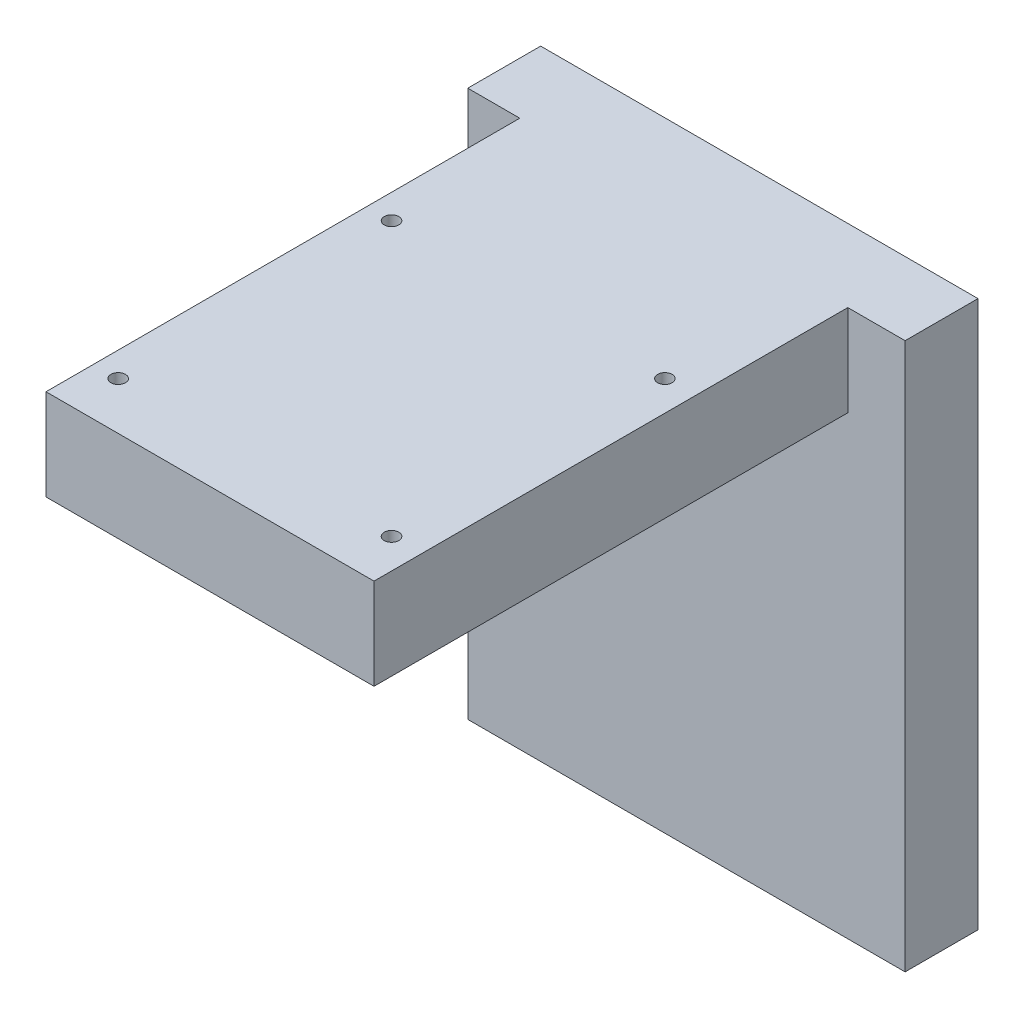
ISO-10303-21;
HEADER;
FILE_DESCRIPTION(('STEP AP214'),'2;1');
FILE_NAME('part.step','',(''),(''),'','','');
FILE_SCHEMA(('AUTOMOTIVE_DESIGN { 1 0 10303 214 1 1 1 1 }'));
ENDSEC;
DATA;
#1=APPLICATION_CONTEXT('core data for automotive mechanical design processes');
#2=APPLICATION_PROTOCOL_DEFINITION('international standard','automotive_design',2000,#1);
#3=PRODUCT_CONTEXT('',#1,'mechanical');
#4=PRODUCT('Part','Part','',(#3));
#5=PRODUCT_RELATED_PRODUCT_CATEGORY('part','',(#4));
#6=PRODUCT_DEFINITION_FORMATION('','',#4);
#7=PRODUCT_DEFINITION_CONTEXT('part definition',#1,'design');
#8=PRODUCT_DEFINITION('design','',#6,#7);
#9=PRODUCT_DEFINITION_SHAPE('','',#8);
#10=(LENGTH_UNIT() NAMED_UNIT(*) SI_UNIT(.MILLI.,.METRE.));
#11=(NAMED_UNIT(*) PLANE_ANGLE_UNIT() SI_UNIT($,.RADIAN.));
#12=(NAMED_UNIT(*) SI_UNIT($,.STERADIAN.) SOLID_ANGLE_UNIT());
#13=UNCERTAINTY_MEASURE_WITH_UNIT(LENGTH_MEASURE(1.E-05),#10,'distance_accuracy_value','');
#14=(GEOMETRIC_REPRESENTATION_CONTEXT(3) GLOBAL_UNCERTAINTY_ASSIGNED_CONTEXT((#13)) GLOBAL_UNIT_ASSIGNED_CONTEXT((#10,
#11,#12)) REPRESENTATION_CONTEXT('',''));
#15=CARTESIAN_POINT('',(0.,0.,0.));
#16=DIRECTION('',(0.,0.,1.));
#17=DIRECTION('',(1.,0.,0.));
#18=AXIS2_PLACEMENT_3D('',#15,#16,#17);
#19=CARTESIAN_POINT('',(-51.4923970450176,20.,42.397966669969));
#20=DIRECTION('',(0.,1.,0.));
#21=DIRECTION('',(0.,0.,1.));
#22=AXIS2_PLACEMENT_3D('',#19,#20,#21);
#23=CYLINDRICAL_SURFACE('',#22,2.);
#24=CARTESIAN_POINT('',(-51.4923970450176,150.,42.397966669969));
#25=DIRECTION('',(0.,1.,0.));
#26=DIRECTION('',(0.,0.,1.));
#27=AXIS2_PLACEMENT_3D('',#24,#25,#26);
#28=CIRCLE('',#27,2.);
#29=CARTESIAN_POINT('',(-51.4923970450176,150.,44.397966669969));
#30=VERTEX_POINT('',#29);
#31=EDGE_CURVE('E154',#30,#30,#28,.T.);
#32=ORIENTED_EDGE('',*,*,#31,.T.);
#33=EDGE_LOOP('',(#32));
#34=FACE_BOUND('',#33,.T.);
#35=CARTESIAN_POINT('',(-51.4923970450176,142.,42.397966669969));
#36=DIRECTION('',(0.,-1.,0.));
#37=DIRECTION('',(1.,0.,0.));
#38=AXIS2_PLACEMENT_3D('',#35,#36,#37);
#39=CIRCLE('',#38,2.);
#40=CARTESIAN_POINT('',(-49.4923970450176,142.,42.397966669969));
#41=VERTEX_POINT('',#40);
#42=EDGE_CURVE('E43',#41,#41,#39,.F.);
#43=ORIENTED_EDGE('',*,*,#42,.F.);
#44=EDGE_LOOP('',(#43));
#45=FACE_BOUND('',#44,.T.);
#46=ADVANCED_FACE('F39',(#34,#45),#23,.F.);
#47=CARTESIAN_POINT('',(23.5076029549824,20.,117.400462624399));
#48=DIRECTION('',(0.,1.,0.));
#49=DIRECTION('',(0.,0.,1.));
#50=AXIS2_PLACEMENT_3D('',#47,#48,#49);
#51=CYLINDRICAL_SURFACE('',#50,2.);
#52=CARTESIAN_POINT('',(23.5076029549824,150.,117.400462624399));
#53=DIRECTION('',(0.,1.,0.));
#54=DIRECTION('',(0.,0.,1.));
#55=AXIS2_PLACEMENT_3D('',#52,#53,#54);
#56=CIRCLE('',#55,2.);
#57=CARTESIAN_POINT('',(23.5076029549824,150.,119.400462624399));
#58=VERTEX_POINT('',#57);
#59=EDGE_CURVE('E212',#58,#58,#56,.T.);
#60=ORIENTED_EDGE('',*,*,#59,.T.);
#61=EDGE_LOOP('',(#60));
#62=FACE_BOUND('',#61,.T.);
#63=CARTESIAN_POINT('',(23.5076029549824,142.,117.400462624399));
#64=DIRECTION('',(0.,-1.,0.));
#65=DIRECTION('',(1.,0.,0.));
#66=AXIS2_PLACEMENT_3D('',#63,#64,#65);
#67=CIRCLE('',#66,2.);
#68=CARTESIAN_POINT('',(25.5076029549824,142.,117.400462624399));
#69=VERTEX_POINT('',#68);
#70=EDGE_CURVE('E205',#69,#69,#67,.F.);
#71=ORIENTED_EDGE('',*,*,#70,.F.);
#72=EDGE_LOOP('',(#71));
#73=FACE_BOUND('',#72,.T.);
#74=ADVANCED_FACE('F265',(#62,#73),#51,.F.);
#75=CARTESIAN_POINT('',(-51.4923970450176,20.,117.400462624399));
#76=DIRECTION('',(0.,1.,0.));
#77=DIRECTION('',(0.,0.,1.));
#78=AXIS2_PLACEMENT_3D('',#75,#76,#77);
#79=CYLINDRICAL_SURFACE('',#78,2.);
#80=CARTESIAN_POINT('',(-51.4923970450176,150.,117.400462624399));
#81=DIRECTION('',(0.,1.,0.));
#82=DIRECTION('',(0.,0.,1.));
#83=AXIS2_PLACEMENT_3D('',#80,#81,#82);
#84=CIRCLE('',#83,2.);
#85=CARTESIAN_POINT('',(-51.4923970450176,150.,119.400462624399));
#86=VERTEX_POINT('',#85);
#87=EDGE_CURVE('E217',#86,#86,#84,.T.);
#88=ORIENTED_EDGE('',*,*,#87,.T.);
#89=EDGE_LOOP('',(#88));
#90=FACE_BOUND('',#89,.T.);
#91=CARTESIAN_POINT('',(-51.4923970450176,142.,117.400462624399));
#92=DIRECTION('',(0.,-1.,0.));
#93=DIRECTION('',(1.,0.,0.));
#94=AXIS2_PLACEMENT_3D('',#91,#92,#93);
#95=CIRCLE('',#94,2.);
#96=CARTESIAN_POINT('',(-49.4923970450176,142.,117.400462624399));
#97=VERTEX_POINT('',#96);
#98=EDGE_CURVE('E201',#97,#97,#95,.F.);
#99=ORIENTED_EDGE('',*,*,#98,.F.);
#100=EDGE_LOOP('',(#99));
#101=FACE_BOUND('',#100,.T.);
#102=ADVANCED_FACE('F270',(#90,#101),#79,.F.);
#103=CARTESIAN_POINT('',(23.5076029134505,20.,42.4004626243991));
#104=DIRECTION('',(0.,1.,0.));
#105=DIRECTION('',(0.,0.,1.));
#106=AXIS2_PLACEMENT_3D('',#103,#104,#105);
#107=CYLINDRICAL_SURFACE('',#106,2.00000000000001);
#108=CARTESIAN_POINT('',(23.5076029134505,150.,42.4004626243991));
#109=DIRECTION('',(0.,1.,0.));
#110=DIRECTION('',(0.,0.,1.));
#111=AXIS2_PLACEMENT_3D('',#108,#109,#110);
#112=CIRCLE('',#111,2.00000000000001);
#113=CARTESIAN_POINT('',(23.5076029134505,150.,44.4004626243991));
#114=VERTEX_POINT('',#113);
#115=EDGE_CURVE('E223',#114,#114,#112,.T.);
#116=ORIENTED_EDGE('',*,*,#115,.T.);
#117=EDGE_LOOP('',(#116));
#118=FACE_BOUND('',#117,.T.);
#119=CARTESIAN_POINT('',(23.5076029134505,142.,42.4004626243991));
#120=DIRECTION('',(0.,-1.,0.));
#121=DIRECTION('',(1.,0.,0.));
#122=AXIS2_PLACEMENT_3D('',#119,#120,#121);
#123=CIRCLE('',#122,2.00000000000001);
#124=CARTESIAN_POINT('',(25.5076029134505,142.,42.4004626243991));
#125=VERTEX_POINT('',#124);
#126=EDGE_CURVE('E197',#125,#125,#123,.F.);
#127=ORIENTED_EDGE('',*,*,#126,.F.);
#128=EDGE_LOOP('',(#127));
#129=FACE_BOUND('',#128,.T.);
#130=ADVANCED_FACE('F393',(#118,#129),#107,.F.);
#131=CARTESIAN_POINT('',(-72.5362318840579,150.,0.434782608695648));
#132=DIRECTION('',(0.,0.,-1.));
#133=DIRECTION('',(-1.,0.,0.));
#134=AXIS2_PLACEMENT_3D('',#131,#132,#133);
#135=PLANE('',#134);
#136=DIRECTION('',(0.,-1.,0.));
#137=VECTOR('',#136,1.);
#138=CARTESIAN_POINT('',(-58.2615279703338,150.,0.434782608695648));
#139=LINE('',#138,#137);
#140=CARTESIAN_POINT('',(-58.2615279703338,150.,0.434782608695648));
#141=VERTEX_POINT('',#140);
#142=CARTESIAN_POINT('',(-58.2615279703338,125.,0.434782608695648));
#143=VERTEX_POINT('',#142);
#144=EDGE_CURVE('E129',#141,#143,#139,.T.);
#145=ORIENTED_EDGE('',*,*,#144,.F.);
#146=DIRECTION('',(1.,0.,0.));
#147=VECTOR('',#146,1.);
#148=CARTESIAN_POINT('',(-72.5362318840579,150.,0.434782608695648));
#149=LINE('',#148,#147);
#150=CARTESIAN_POINT('',(-72.5362318840579,150.,0.434782608695648));
#151=VERTEX_POINT('',#150);
#152=EDGE_CURVE('E94',#151,#141,#149,.T.);
#153=ORIENTED_EDGE('',*,*,#152,.F.);
#154=DIRECTION('',(0.,-1.,0.));
#155=VECTOR('',#154,1.);
#156=CARTESIAN_POINT('',(-72.5362318840579,150.,0.434782608695648));
#157=LINE('',#156,#155);
#158=CARTESIAN_POINT('',(-72.5362318840579,0.,0.434782608695648));
#159=VERTEX_POINT('',#158);
#160=EDGE_CURVE('E11',#151,#159,#157,.T.);
#161=ORIENTED_EDGE('',*,*,#160,.T.);
#162=DIRECTION('',(1.,0.,0.));
#163=VECTOR('',#162,1.);
#164=CARTESIAN_POINT('',(-72.5362318840579,0.,0.434782608695648));
#165=LINE('',#164,#163);
#166=CARTESIAN_POINT('',(47.4637681159421,0.,0.434782608695648));
#167=VERTEX_POINT('',#166);
#168=EDGE_CURVE('E181',#159,#167,#165,.T.);
#169=ORIENTED_EDGE('',*,*,#168,.T.);
#170=DIRECTION('',(0.,-1.,0.));
#171=VECTOR('',#170,1.);
#172=CARTESIAN_POINT('',(47.4637681159421,150.,0.434782608695648));
#173=LINE('',#172,#171);
#174=CARTESIAN_POINT('',(47.4637681159421,150.,0.434782608695648));
#175=VERTEX_POINT('',#174);
#176=EDGE_CURVE('E49',#175,#167,#173,.T.);
#177=ORIENTED_EDGE('',*,*,#176,.F.);
#178=CARTESIAN_POINT('',(31.7384720296662,150.,0.434782608695648));
#179=VERTEX_POINT('',#178);
#180=EDGE_CURVE('E169',#179,#175,#149,.T.);
#181=ORIENTED_EDGE('',*,*,#180,.F.);
#182=DIRECTION('',(0.,-1.,0.));
#183=VECTOR('',#182,1.);
#184=CARTESIAN_POINT('',(31.7384720296662,150.,0.434782608695648));
#185=LINE('',#184,#183);
#186=CARTESIAN_POINT('',(31.7384720296662,125.,0.434782608695648));
#187=VERTEX_POINT('',#186);
#188=EDGE_CURVE('E153',#179,#187,#185,.T.);
#189=ORIENTED_EDGE('',*,*,#188,.T.);
#190=DIRECTION('',(1.,0.,0.));
#191=VECTOR('',#190,1.);
#192=CARTESIAN_POINT('',(-58.2615279703338,125.,0.434782608695648));
#193=LINE('',#192,#191);
#194=EDGE_CURVE('E57',#143,#187,#193,.T.);
#195=ORIENTED_EDGE('',*,*,#194,.F.);
#196=EDGE_LOOP('',(#145,#153,#161,#169,#177,#181,#189,#195));
#197=FACE_BOUND('',#196,.T.);
#198=ADVANCED_FACE('F247',(#197),#135,.F.);
#199=CARTESIAN_POINT('',(-72.5362318840579,150.,-19.5652173913044));
#200=DIRECTION('',(1.,0.,0.));
#201=DIRECTION('',(0.,0.,-1.));
#202=AXIS2_PLACEMENT_3D('',#199,#200,#201);
#203=PLANE('',#202);
#204=DIRECTION('',(0.,0.,1.));
#205=VECTOR('',#204,1.);
#206=CARTESIAN_POINT('',(-72.5362318840579,0.,-19.5652173913044));
#207=LINE('',#206,#205);
#208=CARTESIAN_POINT('',(-72.5362318840579,0.,-19.5652173913044));
#209=VERTEX_POINT('',#208);
#210=EDGE_CURVE('E137',#209,#159,#207,.T.);
#211=ORIENTED_EDGE('',*,*,#210,.T.);
#212=ORIENTED_EDGE('',*,*,#160,.F.);
#213=DIRECTION('',(0.,0.,1.));
#214=VECTOR('',#213,1.);
#215=CARTESIAN_POINT('',(-72.5362318840579,150.,-19.5652173913044));
#216=LINE('',#215,#214);
#217=CARTESIAN_POINT('',(-72.5362318840579,150.,-19.5652173913044));
#218=VERTEX_POINT('',#217);
#219=EDGE_CURVE('E166',#218,#151,#216,.T.);
#220=ORIENTED_EDGE('',*,*,#219,.F.);
#221=DIRECTION('',(0.,-1.,0.));
#222=VECTOR('',#221,1.);
#223=CARTESIAN_POINT('',(-72.5362318840579,150.,-19.5652173913044));
#224=LINE('',#223,#222);
#225=EDGE_CURVE('E177',#218,#209,#224,.T.);
#226=ORIENTED_EDGE('',*,*,#225,.T.);
#227=EDGE_LOOP('',(#211,#212,#220,#226));
#228=FACE_BOUND('',#227,.T.);
#229=ADVANCED_FACE('F41',(#228),#203,.F.);
#230=CARTESIAN_POINT('',(47.4637681159421,150.,-19.5652173913044));
#231=DIRECTION('',(-1.,0.,0.));
#232=DIRECTION('',(0.,0.,1.));
#233=AXIS2_PLACEMENT_3D('',#230,#231,#232);
#234=PLANE('',#233);
#235=DIRECTION('',(0.,0.,-1.));
#236=VECTOR('',#235,1.);
#237=CARTESIAN_POINT('',(47.4637681159421,0.,-19.5652173913044));
#238=LINE('',#237,#236);
#239=CARTESIAN_POINT('',(47.4637681159421,0.,-19.5652173913044));
#240=VERTEX_POINT('',#239);
#241=EDGE_CURVE('E184',#167,#240,#238,.T.);
#242=ORIENTED_EDGE('',*,*,#241,.T.);
#243=DIRECTION('',(0.,-1.,0.));
#244=VECTOR('',#243,1.);
#245=CARTESIAN_POINT('',(47.4637681159421,150.,-19.5652173913044));
#246=LINE('',#245,#244);
#247=CARTESIAN_POINT('',(47.4637681159421,150.,-19.5652173913044));
#248=VERTEX_POINT('',#247);
#249=EDGE_CURVE('E191',#248,#240,#246,.T.);
#250=ORIENTED_EDGE('',*,*,#249,.F.);
#251=DIRECTION('',(0.,0.,-1.));
#252=VECTOR('',#251,1.);
#253=CARTESIAN_POINT('',(47.4637681159421,150.,-19.5652173913044));
#254=LINE('',#253,#252);
#255=EDGE_CURVE('E172',#175,#248,#254,.T.);
#256=ORIENTED_EDGE('',*,*,#255,.F.);
#257=ORIENTED_EDGE('',*,*,#176,.T.);
#258=EDGE_LOOP('',(#242,#250,#256,#257));
#259=FACE_BOUND('',#258,.T.);
#260=ADVANCED_FACE('F254',(#259),#234,.F.);
#261=CARTESIAN_POINT('',(-72.5362318840579,150.,-19.5652173913044));
#262=DIRECTION('',(0.,0.,1.));
#263=DIRECTION('',(1.,0.,0.));
#264=AXIS2_PLACEMENT_3D('',#261,#262,#263);
#265=PLANE('',#264);
#266=DIRECTION('',(-1.,0.,0.));
#267=VECTOR('',#266,1.);
#268=CARTESIAN_POINT('',(-72.5362318840579,0.,-19.5652173913044));
#269=LINE('',#268,#267);
#270=EDGE_CURVE('E87',#240,#209,#269,.T.);
#271=ORIENTED_EDGE('',*,*,#270,.T.);
#272=ORIENTED_EDGE('',*,*,#225,.F.);
#273=DIRECTION('',(-1.,0.,0.));
#274=VECTOR('',#273,1.);
#275=CARTESIAN_POINT('',(-72.5362318840579,150.,-19.5652173913044));
#276=LINE('',#275,#274);
#277=EDGE_CURVE('E66',#248,#218,#276,.T.);
#278=ORIENTED_EDGE('',*,*,#277,.F.);
#279=ORIENTED_EDGE('',*,*,#249,.T.);
#280=EDGE_LOOP('',(#271,#272,#278,#279));
#281=FACE_BOUND('',#280,.T.);
#282=ADVANCED_FACE('F240',(#281),#265,.F.);
#283=CARTESIAN_POINT('',(0.,150.,0.));
#284=DIRECTION('',(0.,1.,0.));
#285=DIRECTION('',(0.,0.,1.));
#286=AXIS2_PLACEMENT_3D('',#283,#284,#285);
#287=PLANE('',#286);
#288=ORIENTED_EDGE('',*,*,#115,.F.);
#289=EDGE_LOOP('',(#288));
#290=FACE_BOUND('',#289,.T.);
#291=ORIENTED_EDGE('',*,*,#87,.F.);
#292=EDGE_LOOP('',(#291));
#293=FACE_BOUND('',#292,.T.);
#294=ORIENTED_EDGE('',*,*,#59,.F.);
#295=EDGE_LOOP('',(#294));
#296=FACE_BOUND('',#295,.T.);
#297=ORIENTED_EDGE('',*,*,#31,.F.);
#298=EDGE_LOOP('',(#297));
#299=FACE_BOUND('',#298,.T.);
#300=ORIENTED_EDGE('',*,*,#219,.T.);
#301=ORIENTED_EDGE('',*,*,#152,.T.);
#302=DIRECTION('',(0.,0.,-1.));
#303=VECTOR('',#302,1.);
#304=CARTESIAN_POINT('',(-58.2615279703338,150.,130.434782608696));
#305=LINE('',#304,#303);
#306=CARTESIAN_POINT('',(-58.2615279703338,150.,130.434782608696));
#307=VERTEX_POINT('',#306);
#308=EDGE_CURVE('E161',#307,#141,#305,.T.);
#309=ORIENTED_EDGE('',*,*,#308,.F.);
#310=DIRECTION('',(1.,0.,0.));
#311=VECTOR('',#310,1.);
#312=CARTESIAN_POINT('',(-58.2615279703338,150.,130.434782608696));
#313=LINE('',#312,#311);
#314=CARTESIAN_POINT('',(31.7384720296662,150.,130.434782608696));
#315=VERTEX_POINT('',#314);
#316=EDGE_CURVE('E142',#307,#315,#313,.T.);
#317=ORIENTED_EDGE('',*,*,#316,.T.);
#318=DIRECTION('',(0.,0.,-1.));
#319=VECTOR('',#318,1.);
#320=CARTESIAN_POINT('',(31.7384720296662,150.,130.434782608696));
#321=LINE('',#320,#319);
#322=EDGE_CURVE('E138',#315,#179,#321,.T.);
#323=ORIENTED_EDGE('',*,*,#322,.T.);
#324=ORIENTED_EDGE('',*,*,#180,.T.);
#325=ORIENTED_EDGE('',*,*,#255,.T.);
#326=ORIENTED_EDGE('',*,*,#277,.T.);
#327=EDGE_LOOP('',(#300,#301,#309,#317,#323,#324,#325,#326));
#328=FACE_BOUND('',#327,.T.);
#329=ADVANCED_FACE('F237',(#290,#293,#296,#299,#328),#287,.T.);
#330=CARTESIAN_POINT('',(0.,0.,0.));
#331=DIRECTION('',(0.,1.,0.));
#332=DIRECTION('',(0.,0.,1.));
#333=AXIS2_PLACEMENT_3D('',#330,#331,#332);
#334=PLANE('',#333);
#335=ORIENTED_EDGE('',*,*,#210,.F.);
#336=ORIENTED_EDGE('',*,*,#270,.F.);
#337=ORIENTED_EDGE('',*,*,#241,.F.);
#338=ORIENTED_EDGE('',*,*,#168,.F.);
#339=EDGE_LOOP('',(#335,#336,#337,#338));
#340=FACE_BOUND('',#339,.T.);
#341=ADVANCED_FACE('F239',(#340),#334,.F.);
#342=CARTESIAN_POINT('',(-58.2615279703338,125.,130.434782608696));
#343=DIRECTION('',(0.,1.,0.));
#344=DIRECTION('',(-1.,0.,0.));
#345=AXIS2_PLACEMENT_3D('',#342,#343,#344);
#346=PLANE('',#345);
#347=CARTESIAN_POINT('',(-51.4923970450176,125.,42.397966669969));
#348=DIRECTION('',(0.,-1.,0.));
#349=DIRECTION('',(1.,0.,0.));
#350=AXIS2_PLACEMENT_3D('',#347,#348,#349);
#351=CIRCLE('',#350,5.);
#352=CARTESIAN_POINT('',(-46.4923970450176,125.,42.397966669969));
#353=VERTEX_POINT('',#352);
#354=EDGE_CURVE('E471',#353,#353,#351,.T.);
#355=ORIENTED_EDGE('',*,*,#354,.F.);
#356=EDGE_LOOP('',(#355));
#357=FACE_BOUND('',#356,.T.);
#358=CARTESIAN_POINT('',(23.5076029134505,125.,42.4004626243991));
#359=DIRECTION('',(0.,-1.,0.));
#360=DIRECTION('',(1.,0.,0.));
#361=AXIS2_PLACEMENT_3D('',#358,#359,#360);
#362=CIRCLE('',#361,5.);
#363=CARTESIAN_POINT('',(28.5076029134505,125.,42.4004626243991));
#364=VERTEX_POINT('',#363);
#365=EDGE_CURVE('E475',#364,#364,#362,.T.);
#366=ORIENTED_EDGE('',*,*,#365,.F.);
#367=EDGE_LOOP('',(#366));
#368=FACE_BOUND('',#367,.T.);
#369=CARTESIAN_POINT('',(23.5076029549824,125.,117.400462624399));
#370=DIRECTION('',(0.,-1.,0.));
#371=DIRECTION('',(1.,0.,0.));
#372=AXIS2_PLACEMENT_3D('',#369,#370,#371);
#373=CIRCLE('',#372,5.);
#374=CARTESIAN_POINT('',(28.5076029549824,125.,117.400462624399));
#375=VERTEX_POINT('',#374);
#376=EDGE_CURVE('E488',#375,#375,#373,.T.);
#377=ORIENTED_EDGE('',*,*,#376,.F.);
#378=EDGE_LOOP('',(#377));
#379=FACE_BOUND('',#378,.T.);
#380=CARTESIAN_POINT('',(-51.4923970450176,125.,117.400462624399));
#381=DIRECTION('',(0.,-1.,0.));
#382=DIRECTION('',(1.,0.,0.));
#383=AXIS2_PLACEMENT_3D('',#380,#381,#382);
#384=CIRCLE('',#383,5.);
#385=CARTESIAN_POINT('',(-46.4923970450176,125.,117.400462624399));
#386=VERTEX_POINT('',#385);
#387=EDGE_CURVE('E227',#386,#386,#384,.T.);
#388=ORIENTED_EDGE('',*,*,#387,.F.);
#389=EDGE_LOOP('',(#388));
#390=FACE_BOUND('',#389,.T.);
#391=ORIENTED_EDGE('',*,*,#194,.T.);
#392=DIRECTION('',(0.,0.,-1.));
#393=VECTOR('',#392,1.);
#394=CARTESIAN_POINT('',(31.7384720296662,125.,130.434782608696));
#395=LINE('',#394,#393);
#396=CARTESIAN_POINT('',(31.7384720296662,125.,130.434782608696));
#397=VERTEX_POINT('',#396);
#398=EDGE_CURVE('E131',#397,#187,#395,.T.);
#399=ORIENTED_EDGE('',*,*,#398,.F.);
#400=DIRECTION('',(1.,0.,0.));
#401=VECTOR('',#400,1.);
#402=CARTESIAN_POINT('',(-58.2615279703338,125.,130.434782608696));
#403=LINE('',#402,#401);
#404=CARTESIAN_POINT('',(-58.2615279703338,125.,130.434782608696));
#405=VERTEX_POINT('',#404);
#406=EDGE_CURVE('E119',#405,#397,#403,.T.);
#407=ORIENTED_EDGE('',*,*,#406,.F.);
#408=DIRECTION('',(0.,0.,-1.));
#409=VECTOR('',#408,1.);
#410=CARTESIAN_POINT('',(-58.2615279703338,125.,130.434782608696));
#411=LINE('',#410,#409);
#412=EDGE_CURVE('E150',#405,#143,#411,.T.);
#413=ORIENTED_EDGE('',*,*,#412,.T.);
#414=EDGE_LOOP('',(#391,#399,#407,#413));
#415=FACE_BOUND('',#414,.T.);
#416=ADVANCED_FACE('F132',(#357,#368,#379,#390,#415),#346,.F.);
#417=CARTESIAN_POINT('',(31.7384720296662,150.,130.434782608696));
#418=DIRECTION('',(1.,0.,0.));
#419=DIRECTION('',(0.,0.,-1.));
#420=AXIS2_PLACEMENT_3D('',#417,#418,#419);
#421=PLANE('',#420);
#422=ORIENTED_EDGE('',*,*,#188,.F.);
#423=ORIENTED_EDGE('',*,*,#322,.F.);
#424=DIRECTION('',(0.,-1.,0.));
#425=VECTOR('',#424,1.);
#426=CARTESIAN_POINT('',(31.7384720296662,150.,130.434782608696));
#427=LINE('',#426,#425);
#428=EDGE_CURVE('E123',#315,#397,#427,.T.);
#429=ORIENTED_EDGE('',*,*,#428,.T.);
#430=ORIENTED_EDGE('',*,*,#398,.T.);
#431=EDGE_LOOP('',(#422,#423,#429,#430));
#432=FACE_BOUND('',#431,.T.);
#433=ADVANCED_FACE('F140',(#432),#421,.T.);
#434=CARTESIAN_POINT('',(-58.2615279703338,150.,130.434782608696));
#435=DIRECTION('',(1.,0.,0.));
#436=DIRECTION('',(0.,1.,0.));
#437=AXIS2_PLACEMENT_3D('',#434,#435,#436);
#438=PLANE('',#437);
#439=ORIENTED_EDGE('',*,*,#144,.T.);
#440=ORIENTED_EDGE('',*,*,#412,.F.);
#441=DIRECTION('',(0.,-1.,0.));
#442=VECTOR('',#441,1.);
#443=CARTESIAN_POINT('',(-58.2615279703338,150.,130.434782608696));
#444=LINE('',#443,#442);
#445=EDGE_CURVE('E126',#307,#405,#444,.T.);
#446=ORIENTED_EDGE('',*,*,#445,.F.);
#447=ORIENTED_EDGE('',*,*,#308,.T.);
#448=EDGE_LOOP('',(#439,#440,#446,#447));
#449=FACE_BOUND('',#448,.T.);
#450=ADVANCED_FACE('F278',(#449),#438,.F.);
#451=CARTESIAN_POINT('',(0.,0.,130.434782608696));
#452=DIRECTION('',(0.,0.,-1.));
#453=DIRECTION('',(-1.,0.,0.));
#454=AXIS2_PLACEMENT_3D('',#451,#452,#453);
#455=PLANE('',#454);
#456=ORIENTED_EDGE('',*,*,#406,.T.);
#457=ORIENTED_EDGE('',*,*,#428,.F.);
#458=ORIENTED_EDGE('',*,*,#316,.F.);
#459=ORIENTED_EDGE('',*,*,#445,.T.);
#460=EDGE_LOOP('',(#456,#457,#458,#459));
#461=FACE_BOUND('',#460,.T.);
#462=ADVANCED_FACE('F120',(#461),#455,.F.);
#463=CARTESIAN_POINT('',(23.5076029134505,142.,42.4004626243991));
#464=DIRECTION('',(0.,-1.,0.));
#465=DIRECTION('',(1.,0.,0.));
#466=AXIS2_PLACEMENT_3D('',#463,#464,#465);
#467=PLANE('',#466);
#468=CARTESIAN_POINT('',(23.5076029134505,142.,42.4004626243991));
#469=DIRECTION('',(0.,-1.,0.));
#470=DIRECTION('',(1.,0.,0.));
#471=AXIS2_PLACEMENT_3D('',#468,#469,#470);
#472=CIRCLE('',#471,5.);
#473=CARTESIAN_POINT('',(28.5076029134505,142.,42.4004626243991));
#474=VERTEX_POINT('',#473);
#475=EDGE_CURVE('E493',#474,#474,#472,.T.);
#476=ORIENTED_EDGE('',*,*,#475,.T.);
#477=EDGE_LOOP('',(#476));
#478=FACE_BOUND('',#477,.T.);
#479=ORIENTED_EDGE('',*,*,#126,.T.);
#480=EDGE_LOOP('',(#479));
#481=FACE_BOUND('',#480,.T.);
#482=ADVANCED_FACE('F277',(#478,#481),#467,.T.);
#483=CARTESIAN_POINT('',(23.5076029134505,142.,42.4004626243991));
#484=DIRECTION('',(0.,-1.,0.));
#485=DIRECTION('',(1.,0.,0.));
#486=AXIS2_PLACEMENT_3D('',#483,#484,#485);
#487=CYLINDRICAL_SURFACE('',#486,5.);
#488=ORIENTED_EDGE('',*,*,#475,.F.);
#489=EDGE_LOOP('',(#488));
#490=FACE_BOUND('',#489,.T.);
#491=ORIENTED_EDGE('',*,*,#365,.T.);
#492=EDGE_LOOP('',(#491));
#493=FACE_BOUND('',#492,.T.);
#494=ADVANCED_FACE('F303',(#490,#493),#487,.F.);
#495=CARTESIAN_POINT('',(-51.4923970450176,142.,117.400462624399));
#496=DIRECTION('',(0.,-1.,0.));
#497=DIRECTION('',(1.,0.,0.));
#498=AXIS2_PLACEMENT_3D('',#495,#496,#497);
#499=PLANE('',#498);
#500=CARTESIAN_POINT('',(-51.4923970450176,142.,117.400462624399));
#501=DIRECTION('',(0.,-1.,0.));
#502=DIRECTION('',(1.,0.,0.));
#503=AXIS2_PLACEMENT_3D('',#500,#501,#502);
#504=CIRCLE('',#503,5.);
#505=CARTESIAN_POINT('',(-46.4923970450176,142.,117.400462624399));
#506=VERTEX_POINT('',#505);
#507=EDGE_CURVE('E202',#506,#506,#504,.T.);
#508=ORIENTED_EDGE('',*,*,#507,.T.);
#509=EDGE_LOOP('',(#508));
#510=FACE_BOUND('',#509,.T.);
#511=ORIENTED_EDGE('',*,*,#98,.T.);
#512=EDGE_LOOP('',(#511));
#513=FACE_BOUND('',#512,.T.);
#514=ADVANCED_FACE('F311',(#510,#513),#499,.T.);
#515=CARTESIAN_POINT('',(-51.4923970450176,142.,117.400462624399));
#516=DIRECTION('',(0.,-1.,0.));
#517=DIRECTION('',(1.,0.,0.));
#518=AXIS2_PLACEMENT_3D('',#515,#516,#517);
#519=CYLINDRICAL_SURFACE('',#518,5.);
#520=ORIENTED_EDGE('',*,*,#507,.F.);
#521=EDGE_LOOP('',(#520));
#522=FACE_BOUND('',#521,.T.);
#523=ORIENTED_EDGE('',*,*,#387,.T.);
#524=EDGE_LOOP('',(#523));
#525=FACE_BOUND('',#524,.T.);
#526=ADVANCED_FACE('F319',(#522,#525),#519,.F.);
#527=CARTESIAN_POINT('',(23.5076029549824,142.,117.400462624399));
#528=DIRECTION('',(0.,-1.,0.));
#529=DIRECTION('',(1.,0.,0.));
#530=AXIS2_PLACEMENT_3D('',#527,#528,#529);
#531=PLANE('',#530);
#532=CARTESIAN_POINT('',(23.5076029549824,142.,117.400462624399));
#533=DIRECTION('',(0.,-1.,0.));
#534=DIRECTION('',(1.,0.,0.));
#535=AXIS2_PLACEMENT_3D('',#532,#533,#534);
#536=CIRCLE('',#535,5.);
#537=CARTESIAN_POINT('',(28.5076029549824,142.,117.400462624399));
#538=VERTEX_POINT('',#537);
#539=EDGE_CURVE('E483',#538,#538,#536,.T.);
#540=ORIENTED_EDGE('',*,*,#539,.T.);
#541=EDGE_LOOP('',(#540));
#542=FACE_BOUND('',#541,.T.);
#543=ORIENTED_EDGE('',*,*,#70,.T.);
#544=EDGE_LOOP('',(#543));
#545=FACE_BOUND('',#544,.T.);
#546=ADVANCED_FACE('F327',(#542,#545),#531,.T.);
#547=CARTESIAN_POINT('',(23.5076029549824,142.,117.400462624399));
#548=DIRECTION('',(0.,-1.,0.));
#549=DIRECTION('',(1.,0.,0.));
#550=AXIS2_PLACEMENT_3D('',#547,#548,#549);
#551=CYLINDRICAL_SURFACE('',#550,5.);
#552=ORIENTED_EDGE('',*,*,#539,.F.);
#553=EDGE_LOOP('',(#552));
#554=FACE_BOUND('',#553,.T.);
#555=ORIENTED_EDGE('',*,*,#376,.T.);
#556=EDGE_LOOP('',(#555));
#557=FACE_BOUND('',#556,.T.);
#558=ADVANCED_FACE('F335',(#554,#557),#551,.F.);
#559=CARTESIAN_POINT('',(-51.4923970450176,142.,42.397966669969));
#560=DIRECTION('',(0.,-1.,0.));
#561=DIRECTION('',(1.,0.,0.));
#562=AXIS2_PLACEMENT_3D('',#559,#560,#561);
#563=PLANE('',#562);
#564=CARTESIAN_POINT('',(-51.4923970450176,142.,42.397966669969));
#565=DIRECTION('',(0.,-1.,0.));
#566=DIRECTION('',(1.,0.,0.));
#567=AXIS2_PLACEMENT_3D('',#564,#565,#566);
#568=CIRCLE('',#567,5.);
#569=CARTESIAN_POINT('',(-46.4923970450176,142.,42.397966669969));
#570=VERTEX_POINT('',#569);
#571=EDGE_CURVE('E468',#570,#570,#568,.T.);
#572=ORIENTED_EDGE('',*,*,#571,.T.);
#573=EDGE_LOOP('',(#572));
#574=FACE_BOUND('',#573,.T.);
#575=ORIENTED_EDGE('',*,*,#42,.T.);
#576=EDGE_LOOP('',(#575));
#577=FACE_BOUND('',#576,.T.);
#578=ADVANCED_FACE('F343',(#574,#577),#563,.T.);
#579=CARTESIAN_POINT('',(-51.4923970450176,142.,42.397966669969));
#580=DIRECTION('',(0.,-1.,0.));
#581=DIRECTION('',(1.,0.,0.));
#582=AXIS2_PLACEMENT_3D('',#579,#580,#581);
#583=CYLINDRICAL_SURFACE('',#582,5.);
#584=ORIENTED_EDGE('',*,*,#571,.F.);
#585=EDGE_LOOP('',(#584));
#586=FACE_BOUND('',#585,.T.);
#587=ORIENTED_EDGE('',*,*,#354,.T.);
#588=EDGE_LOOP('',(#587));
#589=FACE_BOUND('',#588,.T.);
#590=ADVANCED_FACE('F351',(#586,#589),#583,.F.);
#591=CLOSED_SHELL('',(#46,#74,#102,#130,#198,#229,#260,#282,#329,#341,#416,#433,#450,#462,#482,
#494,#514,#526,#546,#558,#578,#590));
#592=MANIFOLD_SOLID_BREP('B2',#591);
#593=ADVANCED_BREP_SHAPE_REPRESENTATION('',(#18,#592),#14);
#594=SHAPE_DEFINITION_REPRESENTATION(#9,#593);
ENDSEC;
END-ISO-10303-21;
